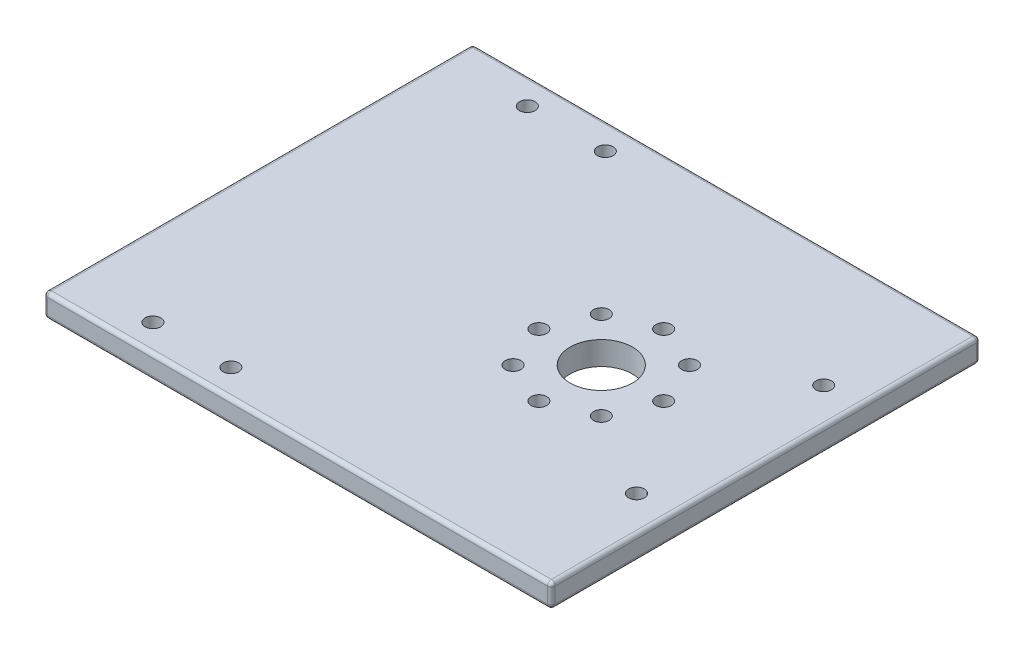
ISO-10303-21;
HEADER;
FILE_DESCRIPTION(('STEP AP214'),'2;1');
FILE_NAME('part.step','',(''),(''),'','','');
FILE_SCHEMA(('AUTOMOTIVE_DESIGN { 1 0 10303 214 1 1 1 1 }'));
ENDSEC;
DATA;
#1=APPLICATION_CONTEXT('core data for automotive mechanical design processes');
#2=APPLICATION_PROTOCOL_DEFINITION('international standard','automotive_design',2000,#1);
#3=PRODUCT_CONTEXT('',#1,'mechanical');
#4=PRODUCT('Part','Part','',(#3));
#5=PRODUCT_RELATED_PRODUCT_CATEGORY('part','',(#4));
#6=PRODUCT_DEFINITION_FORMATION('','',#4);
#7=PRODUCT_DEFINITION_CONTEXT('part definition',#1,'design');
#8=PRODUCT_DEFINITION('design','',#6,#7);
#9=PRODUCT_DEFINITION_SHAPE('','',#8);
#10=(LENGTH_UNIT() NAMED_UNIT(*) SI_UNIT(.MILLI.,.METRE.));
#11=(NAMED_UNIT(*) PLANE_ANGLE_UNIT() SI_UNIT($,.RADIAN.));
#12=(NAMED_UNIT(*) SI_UNIT($,.STERADIAN.) SOLID_ANGLE_UNIT());
#13=UNCERTAINTY_MEASURE_WITH_UNIT(LENGTH_MEASURE(1.E-05),#10,'distance_accuracy_value','');
#14=(GEOMETRIC_REPRESENTATION_CONTEXT(3) GLOBAL_UNCERTAINTY_ASSIGNED_CONTEXT((#13)) GLOBAL_UNIT_ASSIGNED_CONTEXT((#10,
#11,#12)) REPRESENTATION_CONTEXT('',''));
#15=CARTESIAN_POINT('',(0.,0.,0.));
#16=DIRECTION('',(0.,0.,1.));
#17=DIRECTION('',(1.,0.,0.));
#18=AXIS2_PLACEMENT_3D('',#15,#16,#17);
#19=CARTESIAN_POINT('',(0.,551.352995908306,0.));
#20=DIRECTION('',(0.,1.,0.));
#21=DIRECTION('',(0.,0.,1.));
#22=AXIS2_PLACEMENT_3D('',#19,#20,#21);
#23=PLANE('',#22);
#24=CARTESIAN_POINT('',(-33.4856774546059,551.352995908306,-24.));
#25=DIRECTION('',(0.,1.,0.));
#26=DIRECTION('',(0.,0.,1.));
#27=AXIS2_PLACEMENT_3D('',#24,#25,#26);
#28=CIRCLE('',#27,0.999999999999998);
#29=CARTESIAN_POINT('',(-33.4856774546059,551.352995908306,-23.));
#30=VERTEX_POINT('',#29);
#31=EDGE_CURVE('E840',#30,#30,#28,.T.);
#32=ORIENTED_EDGE('',*,*,#31,.F.);
#33=EDGE_LOOP('',(#32));
#34=FACE_BOUND('',#33,.T.);
#35=CARTESIAN_POINT('',(-23.4856774546059,551.352995908306,-24.));
#36=DIRECTION('',(0.,1.,0.));
#37=DIRECTION('',(0.,0.,1.));
#38=AXIS2_PLACEMENT_3D('',#35,#36,#37);
#39=CIRCLE('',#38,1.);
#40=CARTESIAN_POINT('',(-23.4856774546059,551.352995908306,-23.));
#41=VERTEX_POINT('',#40);
#42=EDGE_CURVE('E846',#41,#41,#39,.T.);
#43=ORIENTED_EDGE('',*,*,#42,.F.);
#44=EDGE_LOOP('',(#43));
#45=FACE_BOUND('',#44,.T.);
#46=CARTESIAN_POINT('',(16.5143225453941,551.352995908306,-12.));
#47=DIRECTION('',(0.,1.,0.));
#48=DIRECTION('',(0.,0.,1.));
#49=AXIS2_PLACEMENT_3D('',#46,#47,#48);
#50=CIRCLE('',#49,1.);
#51=CARTESIAN_POINT('',(16.5143225453941,551.352995908306,-11.));
#52=VERTEX_POINT('',#51);
#53=EDGE_CURVE('E852',#52,#52,#50,.T.);
#54=ORIENTED_EDGE('',*,*,#53,.F.);
#55=EDGE_LOOP('',(#54));
#56=FACE_BOUND('',#55,.T.);
#57=CARTESIAN_POINT('',(16.5143225453941,551.352995908306,12.));
#58=DIRECTION('',(0.,1.,0.));
#59=DIRECTION('',(0.,0.,1.));
#60=AXIS2_PLACEMENT_3D('',#57,#58,#59);
#61=CIRCLE('',#60,1.);
#62=CARTESIAN_POINT('',(16.5143225453941,551.352995908306,13.));
#63=VERTEX_POINT('',#62);
#64=EDGE_CURVE('E858',#63,#63,#61,.T.);
#65=ORIENTED_EDGE('',*,*,#64,.F.);
#66=EDGE_LOOP('',(#65));
#67=FACE_BOUND('',#66,.T.);
#68=CARTESIAN_POINT('',(-23.4856774546059,551.352995908306,24.));
#69=DIRECTION('',(0.,1.,0.));
#70=DIRECTION('',(0.,0.,1.));
#71=AXIS2_PLACEMENT_3D('',#68,#69,#70);
#72=CIRCLE('',#71,0.999999999999998);
#73=CARTESIAN_POINT('',(-23.4856774546059,551.352995908306,25.));
#74=VERTEX_POINT('',#73);
#75=EDGE_CURVE('E834',#74,#74,#72,.T.);
#76=ORIENTED_EDGE('',*,*,#75,.F.);
#77=EDGE_LOOP('',(#76));
#78=FACE_BOUND('',#77,.T.);
#79=CARTESIAN_POINT('',(-33.4856774546059,551.352995908306,24.));
#80=DIRECTION('',(0.,1.,0.));
#81=DIRECTION('',(0.,0.,1.));
#82=AXIS2_PLACEMENT_3D('',#79,#80,#81);
#83=CIRCLE('',#82,0.999999999999997);
#84=CARTESIAN_POINT('',(-33.4856774546059,551.352995908306,25.));
#85=VERTEX_POINT('',#84);
#86=EDGE_CURVE('E831',#85,#85,#83,.T.);
#87=ORIENTED_EDGE('',*,*,#86,.F.);
#88=EDGE_LOOP('',(#87));
#89=FACE_BOUND('',#88,.T.);
#90=DIRECTION('',(-1.,0.,0.));
#91=VECTOR('',#90,1.);
#92=CARTESIAN_POINT('',(-43.9856774546059,551.352995908306,-27.0000000000001));
#93=LINE('',#92,#91);
#94=CARTESIAN_POINT('',(20.5941683509698,551.352995908306,-27.0000000000001));
#95=VERTEX_POINT('',#94);
#96=CARTESIAN_POINT('',(-43.4856774546059,551.352995908306,-27.0000000000001));
#97=VERTEX_POINT('',#96);
#98=EDGE_CURVE('E160',#95,#97,#93,.T.);
#99=ORIENTED_EDGE('',*,*,#98,.T.);
#100=DIRECTION('',(0.,0.,1.));
#101=VECTOR('',#100,1.);
#102=CARTESIAN_POINT('',(-43.4856774546059,551.352995908306,27.4999999999999));
#103=LINE('',#102,#101);
#104=CARTESIAN_POINT('',(-43.4856774546059,551.352995908306,26.9999999999999));
#105=VERTEX_POINT('',#104);
#106=EDGE_CURVE('E131',#97,#105,#103,.T.);
#107=ORIENTED_EDGE('',*,*,#106,.T.);
#108=DIRECTION('',(1.,0.,0.));
#109=VECTOR('',#108,1.);
#110=CARTESIAN_POINT('',(21.0941683509698,551.352995908306,26.9999999999999));
#111=LINE('',#110,#109);
#112=CARTESIAN_POINT('',(20.5941683509698,551.352995908306,26.9999999999999));
#113=VERTEX_POINT('',#112);
#114=EDGE_CURVE('E149',#105,#113,#111,.T.);
#115=ORIENTED_EDGE('',*,*,#114,.T.);
#116=DIRECTION('',(0.,0.,-1.));
#117=VECTOR('',#116,1.);
#118=CARTESIAN_POINT('',(20.5941683509698,551.352995908306,-27.5000000000001));
#119=LINE('',#118,#117);
#120=EDGE_CURVE('E155',#113,#95,#119,.T.);
#121=ORIENTED_EDGE('',*,*,#120,.T.);
#122=EDGE_LOOP('',(#99,#107,#115,#121));
#123=FACE_BOUND('',#122,.T.);
#124=CARTESIAN_POINT('',(0.,551.352995908306,-7.99999999999991));
#125=DIRECTION('',(0.,1.,0.));
#126=DIRECTION('',(0.,0.,1.));
#127=AXIS2_PLACEMENT_3D('',#124,#125,#126);
#128=CIRCLE('',#127,0.999999999999999);
#129=CARTESIAN_POINT('',(0.,551.352995908306,-6.99999999999991));
#130=VERTEX_POINT('',#129);
#131=EDGE_CURVE('E824',#130,#130,#128,.T.);
#132=ORIENTED_EDGE('',*,*,#131,.F.);
#133=EDGE_LOOP('',(#132));
#134=FACE_BOUND('',#133,.T.);
#135=CARTESIAN_POINT('',(5.656854249492,551.352995908306,-5.656854249492));
#136=DIRECTION('',(0.,1.,0.));
#137=DIRECTION('',(0.,0.,1.));
#138=AXIS2_PLACEMENT_3D('',#135,#136,#137);
#139=CIRCLE('',#138,0.999999999999976);
#140=CARTESIAN_POINT('',(5.656854249492,551.352995908306,-4.65685424949202));
#141=VERTEX_POINT('',#140);
#142=EDGE_CURVE('E821',#141,#141,#139,.T.);
#143=ORIENTED_EDGE('',*,*,#142,.F.);
#144=EDGE_LOOP('',(#143));
#145=FACE_BOUND('',#144,.T.);
#146=CARTESIAN_POINT('',(8.,551.352995908306,0.));
#147=DIRECTION('',(0.,1.,0.));
#148=DIRECTION('',(0.,0.,1.));
#149=AXIS2_PLACEMENT_3D('',#146,#147,#148);
#150=CIRCLE('',#149,1.);
#151=CARTESIAN_POINT('',(8.,551.352995908306,1.00000000000009));
#152=VERTEX_POINT('',#151);
#153=EDGE_CURVE('E815',#152,#152,#150,.T.);
#154=ORIENTED_EDGE('',*,*,#153,.F.);
#155=EDGE_LOOP('',(#154));
#156=FACE_BOUND('',#155,.T.);
#157=CARTESIAN_POINT('',(5.656854249492,551.352995908306,5.656854249492));
#158=DIRECTION('',(0.,1.,0.));
#159=DIRECTION('',(0.,0.,1.));
#160=AXIS2_PLACEMENT_3D('',#157,#158,#159);
#161=CIRCLE('',#160,0.999999999999976);
#162=CARTESIAN_POINT('',(5.656854249492,551.352995908306,6.65685424949198));
#163=VERTEX_POINT('',#162);
#164=EDGE_CURVE('E809',#163,#163,#161,.T.);
#165=ORIENTED_EDGE('',*,*,#164,.F.);
#166=EDGE_LOOP('',(#165));
#167=FACE_BOUND('',#166,.T.);
#168=CARTESIAN_POINT('',(0.,551.352995908306,8.00000000000009));
#169=DIRECTION('',(0.,1.,0.));
#170=DIRECTION('',(0.,0.,1.));
#171=AXIS2_PLACEMENT_3D('',#168,#169,#170);
#172=CIRCLE('',#171,1.);
#173=CARTESIAN_POINT('',(0.,551.352995908306,9.00000000000009));
#174=VERTEX_POINT('',#173);
#175=EDGE_CURVE('E803',#174,#174,#172,.T.);
#176=ORIENTED_EDGE('',*,*,#175,.F.);
#177=EDGE_LOOP('',(#176));
#178=FACE_BOUND('',#177,.T.);
#179=CARTESIAN_POINT('',(-5.656854249492,551.352995908306,5.656854249492));
#180=DIRECTION('',(0.,1.,0.));
#181=DIRECTION('',(0.,0.,1.));
#182=AXIS2_PLACEMENT_3D('',#179,#180,#181);
#183=CIRCLE('',#182,0.999999999999975);
#184=CARTESIAN_POINT('',(-5.656854249492,551.352995908306,6.65685424949198));
#185=VERTEX_POINT('',#184);
#186=EDGE_CURVE('E797',#185,#185,#183,.T.);
#187=ORIENTED_EDGE('',*,*,#186,.F.);
#188=EDGE_LOOP('',(#187));
#189=FACE_BOUND('',#188,.T.);
#190=CARTESIAN_POINT('',(-8.,551.352995908306,0.));
#191=DIRECTION('',(0.,1.,0.));
#192=DIRECTION('',(0.,0.,1.));
#193=AXIS2_PLACEMENT_3D('',#190,#191,#192);
#194=CIRCLE('',#193,1.);
#195=CARTESIAN_POINT('',(-8.,551.352995908306,1.00000000000009));
#196=VERTEX_POINT('',#195);
#197=EDGE_CURVE('E273',#196,#196,#194,.T.);
#198=ORIENTED_EDGE('',*,*,#197,.F.);
#199=EDGE_LOOP('',(#198));
#200=FACE_BOUND('',#199,.T.);
#201=CARTESIAN_POINT('',(-5.656854249492,551.352995908306,-5.656854249492));
#202=DIRECTION('',(0.,1.,0.));
#203=DIRECTION('',(0.,0.,1.));
#204=AXIS2_PLACEMENT_3D('',#201,#202,#203);
#205=CIRCLE('',#204,0.999999999999975);
#206=CARTESIAN_POINT('',(-5.656854249492,551.352995908306,-4.65685424949202));
#207=VERTEX_POINT('',#206);
#208=EDGE_CURVE('E265',#207,#207,#205,.T.);
#209=ORIENTED_EDGE('',*,*,#208,.F.);
#210=EDGE_LOOP('',(#209));
#211=FACE_BOUND('',#210,.T.);
#212=CARTESIAN_POINT('',(0.,551.352995908306,0.));
#213=DIRECTION('',(0.,1.,0.));
#214=DIRECTION('',(0.,0.,1.));
#215=AXIS2_PLACEMENT_3D('',#212,#213,#214);
#216=CIRCLE('',#215,3.99999999999991);
#217=CARTESIAN_POINT('',(0.,551.352995908306,3.99999999999982));
#218=VERTEX_POINT('',#217);
#219=EDGE_CURVE('E156',#218,#218,#216,.T.);
#220=ORIENTED_EDGE('',*,*,#219,.F.);
#221=EDGE_LOOP('',(#220));
#222=FACE_BOUND('',#221,.T.);
#223=ADVANCED_FACE('F37',(#34,#45,#56,#67,#78,#89,#123,#134,#145,#156,#167,#178,#189,#200,#211,
#222),#23,.T.);
#224=CARTESIAN_POINT('',(0.,548.352995908306,0.));
#225=DIRECTION('',(0.,1.,0.));
#226=DIRECTION('',(0.,0.,1.));
#227=AXIS2_PLACEMENT_3D('',#224,#225,#226);
#228=PLANE('',#227);
#229=CARTESIAN_POINT('',(-33.4856774546059,548.352995908306,-24.));
#230=DIRECTION('',(0.,1.,0.));
#231=DIRECTION('',(0.,0.,1.));
#232=AXIS2_PLACEMENT_3D('',#229,#230,#231);
#233=CIRCLE('',#232,0.999999999999998);
#234=CARTESIAN_POINT('',(-33.4856774546059,548.352995908306,-23.));
#235=VERTEX_POINT('',#234);
#236=EDGE_CURVE('E837',#235,#235,#233,.T.);
#237=ORIENTED_EDGE('',*,*,#236,.T.);
#238=EDGE_LOOP('',(#237));
#239=FACE_BOUND('',#238,.T.);
#240=CARTESIAN_POINT('',(-23.4856774546059,548.352995908306,-24.));
#241=DIRECTION('',(0.,1.,0.));
#242=DIRECTION('',(0.,0.,1.));
#243=AXIS2_PLACEMENT_3D('',#240,#241,#242);
#244=CIRCLE('',#243,1.);
#245=CARTESIAN_POINT('',(-23.4856774546059,548.352995908306,-23.));
#246=VERTEX_POINT('',#245);
#247=EDGE_CURVE('E843',#246,#246,#244,.T.);
#248=ORIENTED_EDGE('',*,*,#247,.T.);
#249=EDGE_LOOP('',(#248));
#250=FACE_BOUND('',#249,.T.);
#251=CARTESIAN_POINT('',(16.5143225453941,548.352995908306,-12.));
#252=DIRECTION('',(0.,1.,0.));
#253=DIRECTION('',(0.,0.,1.));
#254=AXIS2_PLACEMENT_3D('',#251,#252,#253);
#255=CIRCLE('',#254,1.);
#256=CARTESIAN_POINT('',(16.5143225453941,548.352995908306,-11.));
#257=VERTEX_POINT('',#256);
#258=EDGE_CURVE('E849',#257,#257,#255,.T.);
#259=ORIENTED_EDGE('',*,*,#258,.T.);
#260=EDGE_LOOP('',(#259));
#261=FACE_BOUND('',#260,.T.);
#262=CARTESIAN_POINT('',(16.5143225453941,548.352995908306,12.));
#263=DIRECTION('',(0.,1.,0.));
#264=DIRECTION('',(0.,0.,1.));
#265=AXIS2_PLACEMENT_3D('',#262,#263,#264);
#266=CIRCLE('',#265,1.);
#267=CARTESIAN_POINT('',(16.5143225453941,548.352995908306,13.));
#268=VERTEX_POINT('',#267);
#269=EDGE_CURVE('E855',#268,#268,#266,.T.);
#270=ORIENTED_EDGE('',*,*,#269,.T.);
#271=EDGE_LOOP('',(#270));
#272=FACE_BOUND('',#271,.T.);
#273=CARTESIAN_POINT('',(-23.4856774546059,548.352995908306,24.));
#274=DIRECTION('',(0.,1.,0.));
#275=DIRECTION('',(0.,0.,1.));
#276=AXIS2_PLACEMENT_3D('',#273,#274,#275);
#277=CIRCLE('',#276,0.999999999999998);
#278=CARTESIAN_POINT('',(-23.4856774546059,548.352995908306,25.));
#279=VERTEX_POINT('',#278);
#280=EDGE_CURVE('E861',#279,#279,#277,.T.);
#281=ORIENTED_EDGE('',*,*,#280,.T.);
#282=EDGE_LOOP('',(#281));
#283=FACE_BOUND('',#282,.T.);
#284=CARTESIAN_POINT('',(-33.4856774546059,548.352995908306,24.));
#285=DIRECTION('',(0.,1.,0.));
#286=DIRECTION('',(0.,0.,1.));
#287=AXIS2_PLACEMENT_3D('',#284,#285,#286);
#288=CIRCLE('',#287,0.999999999999997);
#289=CARTESIAN_POINT('',(-33.4856774546059,548.352995908306,25.));
#290=VERTEX_POINT('',#289);
#291=EDGE_CURVE('E137',#290,#290,#288,.T.);
#292=ORIENTED_EDGE('',*,*,#291,.T.);
#293=EDGE_LOOP('',(#292));
#294=FACE_BOUND('',#293,.T.);
#295=DIRECTION('',(1.,0.,0.));
#296=VECTOR('',#295,1.);
#297=CARTESIAN_POINT('',(0.,548.352995908306,26.9999999999999));
#298=LINE('',#297,#296);
#299=CARTESIAN_POINT('',(20.5941683509698,548.352995908306,26.9999999999999));
#300=VERTEX_POINT('',#299);
#301=CARTESIAN_POINT('',(-43.4856774546059,548.352995908306,26.9999999999999));
#302=VERTEX_POINT('',#301);
#303=EDGE_CURVE('E173',#300,#302,#298,.F.);
#304=ORIENTED_EDGE('',*,*,#303,.T.);
#305=DIRECTION('',(0.,0.,1.));
#306=VECTOR('',#305,1.);
#307=CARTESIAN_POINT('',(-43.4856774546059,548.352995908306,0.));
#308=LINE('',#307,#306);
#309=CARTESIAN_POINT('',(-43.4856774546059,548.352995908306,-27.0000000000001));
#310=VERTEX_POINT('',#309);
#311=EDGE_CURVE('E179',#302,#310,#308,.F.);
#312=ORIENTED_EDGE('',*,*,#311,.T.);
#313=DIRECTION('',(-1.,0.,0.));
#314=VECTOR('',#313,1.);
#315=CARTESIAN_POINT('',(0.,548.352995908306,-27.0000000000001));
#316=LINE('',#315,#314);
#317=CARTESIAN_POINT('',(20.5941683509698,548.352995908306,-27.0000000000001));
#318=VERTEX_POINT('',#317);
#319=EDGE_CURVE('E177',#310,#318,#316,.F.);
#320=ORIENTED_EDGE('',*,*,#319,.T.);
#321=DIRECTION('',(0.,0.,-1.));
#322=VECTOR('',#321,1.);
#323=CARTESIAN_POINT('',(20.5941683509698,548.352995908306,0.));
#324=LINE('',#323,#322);
#325=EDGE_CURVE('E175',#318,#300,#324,.F.);
#326=ORIENTED_EDGE('',*,*,#325,.T.);
#327=EDGE_LOOP('',(#304,#312,#320,#326));
#328=FACE_BOUND('',#327,.T.);
#329=CARTESIAN_POINT('',(0.,548.352995908306,-7.99999999999991));
#330=DIRECTION('',(0.,1.,0.));
#331=DIRECTION('',(0.,0.,1.));
#332=AXIS2_PLACEMENT_3D('',#329,#330,#331);
#333=CIRCLE('',#332,0.999999999999999);
#334=CARTESIAN_POINT('',(0.,548.352995908306,-6.99999999999991));
#335=VERTEX_POINT('',#334);
#336=EDGE_CURVE('E280',#335,#335,#333,.F.);
#337=ORIENTED_EDGE('',*,*,#336,.F.);
#338=EDGE_LOOP('',(#337));
#339=FACE_BOUND('',#338,.T.);
#340=CARTESIAN_POINT('',(5.656854249492,548.352995908306,-5.656854249492));
#341=DIRECTION('',(0.,1.,0.));
#342=DIRECTION('',(0.,0.,1.));
#343=AXIS2_PLACEMENT_3D('',#340,#341,#342);
#344=CIRCLE('',#343,0.999999999999976);
#345=CARTESIAN_POINT('',(5.656854249492,548.352995908306,-4.65685424949202));
#346=VERTEX_POINT('',#345);
#347=EDGE_CURVE('E818',#346,#346,#344,.F.);
#348=ORIENTED_EDGE('',*,*,#347,.F.);
#349=EDGE_LOOP('',(#348));
#350=FACE_BOUND('',#349,.T.);
#351=CARTESIAN_POINT('',(8.,548.352995908306,0.));
#352=DIRECTION('',(0.,1.,0.));
#353=DIRECTION('',(0.,0.,1.));
#354=AXIS2_PLACEMENT_3D('',#351,#352,#353);
#355=CIRCLE('',#354,1.);
#356=CARTESIAN_POINT('',(8.,548.352995908306,1.00000000000009));
#357=VERTEX_POINT('',#356);
#358=EDGE_CURVE('E812',#357,#357,#355,.F.);
#359=ORIENTED_EDGE('',*,*,#358,.F.);
#360=EDGE_LOOP('',(#359));
#361=FACE_BOUND('',#360,.T.);
#362=CARTESIAN_POINT('',(5.656854249492,548.352995908306,5.656854249492));
#363=DIRECTION('',(0.,1.,0.));
#364=DIRECTION('',(0.,0.,1.));
#365=AXIS2_PLACEMENT_3D('',#362,#363,#364);
#366=CIRCLE('',#365,0.999999999999976);
#367=CARTESIAN_POINT('',(5.656854249492,548.352995908306,6.65685424949198));
#368=VERTEX_POINT('',#367);
#369=EDGE_CURVE('E806',#368,#368,#366,.F.);
#370=ORIENTED_EDGE('',*,*,#369,.F.);
#371=EDGE_LOOP('',(#370));
#372=FACE_BOUND('',#371,.T.);
#373=CARTESIAN_POINT('',(0.,548.352995908306,8.00000000000009));
#374=DIRECTION('',(0.,1.,0.));
#375=DIRECTION('',(0.,0.,1.));
#376=AXIS2_PLACEMENT_3D('',#373,#374,#375);
#377=CIRCLE('',#376,1.);
#378=CARTESIAN_POINT('',(0.,548.352995908306,9.00000000000009));
#379=VERTEX_POINT('',#378);
#380=EDGE_CURVE('E801',#379,#379,#377,.F.);
#381=ORIENTED_EDGE('',*,*,#380,.F.);
#382=EDGE_LOOP('',(#381));
#383=FACE_BOUND('',#382,.T.);
#384=CARTESIAN_POINT('',(-5.656854249492,548.352995908306,5.656854249492));
#385=DIRECTION('',(0.,1.,0.));
#386=DIRECTION('',(0.,0.,1.));
#387=AXIS2_PLACEMENT_3D('',#384,#385,#386);
#388=CIRCLE('',#387,0.999999999999975);
#389=CARTESIAN_POINT('',(-5.656854249492,548.352995908306,6.65685424949198));
#390=VERTEX_POINT('',#389);
#391=EDGE_CURVE('E795',#390,#390,#388,.F.);
#392=ORIENTED_EDGE('',*,*,#391,.F.);
#393=EDGE_LOOP('',(#392));
#394=FACE_BOUND('',#393,.T.);
#395=CARTESIAN_POINT('',(-8.,548.352995908306,0.));
#396=DIRECTION('',(0.,1.,0.));
#397=DIRECTION('',(0.,0.,1.));
#398=AXIS2_PLACEMENT_3D('',#395,#396,#397);
#399=CIRCLE('',#398,1.);
#400=CARTESIAN_POINT('',(-8.,548.352995908306,1.00000000000009));
#401=VERTEX_POINT('',#400);
#402=EDGE_CURVE('E270',#401,#401,#399,.F.);
#403=ORIENTED_EDGE('',*,*,#402,.F.);
#404=EDGE_LOOP('',(#403));
#405=FACE_BOUND('',#404,.T.);
#406=CARTESIAN_POINT('',(-5.656854249492,548.352995908306,-5.656854249492));
#407=DIRECTION('',(0.,1.,0.));
#408=DIRECTION('',(0.,0.,1.));
#409=AXIS2_PLACEMENT_3D('',#406,#407,#408);
#410=CIRCLE('',#409,0.999999999999975);
#411=CARTESIAN_POINT('',(-5.656854249492,548.352995908306,-4.65685424949202));
#412=VERTEX_POINT('',#411);
#413=EDGE_CURVE('E259',#412,#412,#410,.F.);
#414=ORIENTED_EDGE('',*,*,#413,.F.);
#415=EDGE_LOOP('',(#414));
#416=FACE_BOUND('',#415,.T.);
#417=CARTESIAN_POINT('',(0.,548.352995908306,0.));
#418=DIRECTION('',(0.,1.,0.));
#419=DIRECTION('',(0.,0.,1.));
#420=AXIS2_PLACEMENT_3D('',#417,#418,#419);
#421=CIRCLE('',#420,3.99999999999991);
#422=CARTESIAN_POINT('',(0.,548.352995908306,3.99999999999982));
#423=VERTEX_POINT('',#422);
#424=EDGE_CURVE('E278',#423,#423,#421,.T.);
#425=ORIENTED_EDGE('',*,*,#424,.T.);
#426=EDGE_LOOP('',(#425));
#427=FACE_BOUND('',#426,.T.);
#428=ADVANCED_FACE('F335',(#239,#250,#261,#272,#283,#294,#328,#339,#350,#361,#372,#383,#394,
#405,#416,#427),#228,.F.);
#429=CARTESIAN_POINT('',(-43.9856774546059,551.352995908306,-27.5000000000001));
#430=DIRECTION('',(1.,0.,0.));
#431=DIRECTION('',(0.,0.,-1.));
#432=AXIS2_PLACEMENT_3D('',#429,#430,#431);
#433=PLANE('',#432);
#434=DIRECTION('',(0.,0.,1.));
#435=VECTOR('',#434,1.);
#436=CARTESIAN_POINT('',(-43.9856774546059,550.852995908306,-27.5000000000001));
#437=LINE('',#436,#435);
#438=CARTESIAN_POINT('',(-43.9856774546059,550.852995908306,26.9999999999999));
#439=VERTEX_POINT('',#438);
#440=CARTESIAN_POINT('',(-43.9856774546059,550.852995908306,-27.0000000000001));
#441=VERTEX_POINT('',#440);
#442=EDGE_CURVE('E133',#439,#441,#437,.F.);
#443=ORIENTED_EDGE('',*,*,#442,.T.);
#444=DIRECTION('',(0.,-1.,0.));
#445=VECTOR('',#444,1.);
#446=CARTESIAN_POINT('',(-43.9856774546059,551.352995908306,-27.0000000000001));
#447=LINE('',#446,#445);
#448=CARTESIAN_POINT('',(-43.9856774546059,548.852995908306,-27.0000000000001));
#449=VERTEX_POINT('',#448);
#450=EDGE_CURVE('E171',#441,#449,#447,.T.);
#451=ORIENTED_EDGE('',*,*,#450,.T.);
#452=DIRECTION('',(0.,0.,1.));
#453=VECTOR('',#452,1.);
#454=CARTESIAN_POINT('',(-43.9856774546059,548.852995908306,-27.5000000000001));
#455=LINE('',#454,#453);
#456=CARTESIAN_POINT('',(-43.9856774546059,548.852995908306,26.9999999999999));
#457=VERTEX_POINT('',#456);
#458=EDGE_CURVE('E164',#449,#457,#455,.T.);
#459=ORIENTED_EDGE('',*,*,#458,.T.);
#460=DIRECTION('',(0.,-1.,0.));
#461=VECTOR('',#460,1.);
#462=CARTESIAN_POINT('',(-43.9856774546059,551.352995908306,26.9999999999999));
#463=LINE('',#462,#461);
#464=EDGE_CURVE('E162',#457,#439,#463,.F.);
#465=ORIENTED_EDGE('',*,*,#464,.T.);
#466=EDGE_LOOP('',(#443,#451,#459,#465));
#467=FACE_BOUND('',#466,.T.);
#468=ADVANCED_FACE('F305',(#467),#433,.F.);
#469=CARTESIAN_POINT('',(-43.9856774546059,551.352995908306,27.4999999999999));
#470=DIRECTION('',(0.,0.,-1.));
#471=DIRECTION('',(0.,1.,0.));
#472=AXIS2_PLACEMENT_3D('',#469,#470,#471);
#473=PLANE('',#472);
#474=DIRECTION('',(1.,0.,0.));
#475=VECTOR('',#474,1.);
#476=CARTESIAN_POINT('',(-43.9856774546059,550.852995908306,27.4999999999999));
#477=LINE('',#476,#475);
#478=CARTESIAN_POINT('',(20.5941683509698,550.852995908306,27.4999999999999));
#479=VERTEX_POINT('',#478);
#480=CARTESIAN_POINT('',(-43.4856774546059,550.852995908306,27.4999999999999));
#481=VERTEX_POINT('',#480);
#482=EDGE_CURVE('E46',#479,#481,#477,.F.);
#483=ORIENTED_EDGE('',*,*,#482,.T.);
#484=DIRECTION('',(0.,-1.,0.));
#485=VECTOR('',#484,1.);
#486=CARTESIAN_POINT('',(-43.4856774546059,551.352995908306,27.4999999999999));
#487=LINE('',#486,#485);
#488=CARTESIAN_POINT('',(-43.4856774546059,548.852995908306,27.4999999999999));
#489=VERTEX_POINT('',#488);
#490=EDGE_CURVE('E11',#481,#489,#487,.T.);
#491=ORIENTED_EDGE('',*,*,#490,.T.);
#492=DIRECTION('',(1.,0.,0.));
#493=VECTOR('',#492,1.);
#494=CARTESIAN_POINT('',(-43.9856774546059,548.852995908306,27.4999999999999));
#495=LINE('',#494,#493);
#496=CARTESIAN_POINT('',(20.5941683509698,548.852995908306,27.4999999999999));
#497=VERTEX_POINT('',#496);
#498=EDGE_CURVE('E200',#489,#497,#495,.T.);
#499=ORIENTED_EDGE('',*,*,#498,.T.);
#500=DIRECTION('',(0.,-1.,0.));
#501=VECTOR('',#500,1.);
#502=CARTESIAN_POINT('',(20.5941683509698,551.352995908306,27.4999999999999));
#503=LINE('',#502,#501);
#504=EDGE_CURVE('E57',#497,#479,#503,.F.);
#505=ORIENTED_EDGE('',*,*,#504,.T.);
#506=EDGE_LOOP('',(#483,#491,#499,#505));
#507=FACE_BOUND('',#506,.T.);
#508=ADVANCED_FACE('F311',(#507),#473,.F.);
#509=CARTESIAN_POINT('',(21.0941683509698,551.352995908306,-27.5000000000001));
#510=DIRECTION('',(-1.,0.,0.));
#511=DIRECTION('',(0.,0.,1.));
#512=AXIS2_PLACEMENT_3D('',#509,#510,#511);
#513=PLANE('',#512);
#514=DIRECTION('',(0.,-1.,0.));
#515=VECTOR('',#514,1.);
#516=CARTESIAN_POINT('',(21.0941683509698,551.352995908306,-27.0000000000001));
#517=LINE('',#516,#515);
#518=CARTESIAN_POINT('',(21.0941683509698,548.852995908306,-27.0000000000001));
#519=VERTEX_POINT('',#518);
#520=CARTESIAN_POINT('',(21.0941683509698,550.852995908306,-27.0000000000001));
#521=VERTEX_POINT('',#520);
#522=EDGE_CURVE('E195',#519,#521,#517,.F.);
#523=ORIENTED_EDGE('',*,*,#522,.T.);
#524=DIRECTION('',(0.,0.,-1.));
#525=VECTOR('',#524,1.);
#526=CARTESIAN_POINT('',(21.0941683509698,550.852995908306,27.4999999999999));
#527=LINE('',#526,#525);
#528=CARTESIAN_POINT('',(21.0941683509698,550.852995908306,26.9999999999999));
#529=VERTEX_POINT('',#528);
#530=EDGE_CURVE('E197',#521,#529,#527,.F.);
#531=ORIENTED_EDGE('',*,*,#530,.T.);
#532=DIRECTION('',(0.,-1.,0.));
#533=VECTOR('',#532,1.);
#534=CARTESIAN_POINT('',(21.0941683509698,551.352995908306,26.9999999999999));
#535=LINE('',#534,#533);
#536=CARTESIAN_POINT('',(21.0941683509698,548.852995908306,26.9999999999999));
#537=VERTEX_POINT('',#536);
#538=EDGE_CURVE('E191',#529,#537,#535,.T.);
#539=ORIENTED_EDGE('',*,*,#538,.T.);
#540=DIRECTION('',(0.,0.,-1.));
#541=VECTOR('',#540,1.);
#542=CARTESIAN_POINT('',(21.0941683509698,548.852995908306,-27.5000000000001));
#543=LINE('',#542,#541);
#544=EDGE_CURVE('E193',#537,#519,#543,.T.);
#545=ORIENTED_EDGE('',*,*,#544,.T.);
#546=EDGE_LOOP('',(#523,#531,#539,#545));
#547=FACE_BOUND('',#546,.T.);
#548=ADVANCED_FACE('F352',(#547),#513,.F.);
#549=CARTESIAN_POINT('',(-43.9856774546059,551.352995908306,-27.5000000000001));
#550=DIRECTION('',(0.,0.,1.));
#551=DIRECTION('',(1.,0.,0.));
#552=AXIS2_PLACEMENT_3D('',#549,#550,#551);
#553=PLANE('',#552);
#554=DIRECTION('',(0.,-1.,0.));
#555=VECTOR('',#554,1.);
#556=CARTESIAN_POINT('',(-43.4856774546059,551.352995908306,-27.5000000000001));
#557=LINE('',#556,#555);
#558=CARTESIAN_POINT('',(-43.4856774546059,548.852995908306,-27.5000000000001));
#559=VERTEX_POINT('',#558);
#560=CARTESIAN_POINT('',(-43.4856774546059,550.852995908306,-27.5000000000001));
#561=VERTEX_POINT('',#560);
#562=EDGE_CURVE('E186',#559,#561,#557,.F.);
#563=ORIENTED_EDGE('',*,*,#562,.T.);
#564=DIRECTION('',(-1.,0.,0.));
#565=VECTOR('',#564,1.);
#566=CARTESIAN_POINT('',(21.0941683509698,550.852995908306,-27.5000000000001));
#567=LINE('',#566,#565);
#568=CARTESIAN_POINT('',(20.5941683509698,550.852995908306,-27.5000000000001));
#569=VERTEX_POINT('',#568);
#570=EDGE_CURVE('E188',#561,#569,#567,.F.);
#571=ORIENTED_EDGE('',*,*,#570,.T.);
#572=DIRECTION('',(0.,-1.,0.));
#573=VECTOR('',#572,1.);
#574=CARTESIAN_POINT('',(20.5941683509698,551.352995908306,-27.5000000000001));
#575=LINE('',#574,#573);
#576=CARTESIAN_POINT('',(20.5941683509698,548.852995908306,-27.5000000000001));
#577=VERTEX_POINT('',#576);
#578=EDGE_CURVE('E182',#569,#577,#575,.T.);
#579=ORIENTED_EDGE('',*,*,#578,.T.);
#580=DIRECTION('',(-1.,0.,0.));
#581=VECTOR('',#580,1.);
#582=CARTESIAN_POINT('',(-43.9856774546059,548.852995908306,-27.5000000000001));
#583=LINE('',#582,#581);
#584=EDGE_CURVE('E184',#577,#559,#583,.T.);
#585=ORIENTED_EDGE('',*,*,#584,.T.);
#586=EDGE_LOOP('',(#563,#571,#579,#585));
#587=FACE_BOUND('',#586,.T.);
#588=ADVANCED_FACE('F349',(#587),#553,.F.);
#589=CARTESIAN_POINT('',(0.,551.352995908306,0.));
#590=DIRECTION('',(0.,-1.,0.));
#591=DIRECTION('',(0.,0.,-1.));
#592=AXIS2_PLACEMENT_3D('',#589,#590,#591);
#593=CYLINDRICAL_SURFACE('',#592,3.99999999999991);
#594=ORIENTED_EDGE('',*,*,#219,.T.);
#595=EDGE_LOOP('',(#594));
#596=FACE_BOUND('',#595,.T.);
#597=ORIENTED_EDGE('',*,*,#424,.F.);
#598=EDGE_LOOP('',(#597));
#599=FACE_BOUND('',#598,.T.);
#600=ADVANCED_FACE('F346',(#596,#599),#593,.F.);
#601=CARTESIAN_POINT('',(-5.656854249492,545.52456878356,-5.656854249492));
#602=DIRECTION('',(0.,1.,0.));
#603=DIRECTION('',(0.,0.,1.));
#604=AXIS2_PLACEMENT_3D('',#601,#602,#603);
#605=CYLINDRICAL_SURFACE('',#604,0.999999999999975);
#606=ORIENTED_EDGE('',*,*,#413,.T.);
#607=EDGE_LOOP('',(#606));
#608=FACE_BOUND('',#607,.T.);
#609=ORIENTED_EDGE('',*,*,#208,.T.);
#610=EDGE_LOOP('',(#609));
#611=FACE_BOUND('',#610,.T.);
#612=ADVANCED_FACE('F697',(#608,#611),#605,.F.);
#613=CARTESIAN_POINT('',(-8.,545.52456878356,0.));
#614=DIRECTION('',(0.,1.,0.));
#615=DIRECTION('',(0.,0.,1.));
#616=AXIS2_PLACEMENT_3D('',#613,#614,#615);
#617=CYLINDRICAL_SURFACE('',#616,1.);
#618=ORIENTED_EDGE('',*,*,#402,.T.);
#619=EDGE_LOOP('',(#618));
#620=FACE_BOUND('',#619,.T.);
#621=ORIENTED_EDGE('',*,*,#197,.T.);
#622=EDGE_LOOP('',(#621));
#623=FACE_BOUND('',#622,.T.);
#624=ADVANCED_FACE('F686',(#620,#623),#617,.F.);
#625=CARTESIAN_POINT('',(-5.656854249492,545.52456878356,5.656854249492));
#626=DIRECTION('',(0.,1.,0.));
#627=DIRECTION('',(0.,0.,1.));
#628=AXIS2_PLACEMENT_3D('',#625,#626,#627);
#629=CYLINDRICAL_SURFACE('',#628,0.999999999999975);
#630=ORIENTED_EDGE('',*,*,#391,.T.);
#631=EDGE_LOOP('',(#630));
#632=FACE_BOUND('',#631,.T.);
#633=ORIENTED_EDGE('',*,*,#186,.T.);
#634=EDGE_LOOP('',(#633));
#635=FACE_BOUND('',#634,.T.);
#636=ADVANCED_FACE('F675',(#632,#635),#629,.F.);
#637=CARTESIAN_POINT('',(0.,545.52456878356,8.00000000000009));
#638=DIRECTION('',(0.,1.,0.));
#639=DIRECTION('',(0.,0.,1.));
#640=AXIS2_PLACEMENT_3D('',#637,#638,#639);
#641=CYLINDRICAL_SURFACE('',#640,1.);
#642=ORIENTED_EDGE('',*,*,#380,.T.);
#643=EDGE_LOOP('',(#642));
#644=FACE_BOUND('',#643,.T.);
#645=ORIENTED_EDGE('',*,*,#175,.T.);
#646=EDGE_LOOP('',(#645));
#647=FACE_BOUND('',#646,.T.);
#648=ADVANCED_FACE('F664',(#644,#647),#641,.F.);
#649=CARTESIAN_POINT('',(5.656854249492,545.52456878356,5.656854249492));
#650=DIRECTION('',(0.,1.,0.));
#651=DIRECTION('',(0.,0.,1.));
#652=AXIS2_PLACEMENT_3D('',#649,#650,#651);
#653=CYLINDRICAL_SURFACE('',#652,0.999999999999976);
#654=ORIENTED_EDGE('',*,*,#369,.T.);
#655=EDGE_LOOP('',(#654));
#656=FACE_BOUND('',#655,.T.);
#657=ORIENTED_EDGE('',*,*,#164,.T.);
#658=EDGE_LOOP('',(#657));
#659=FACE_BOUND('',#658,.T.);
#660=ADVANCED_FACE('F653',(#656,#659),#653,.F.);
#661=CARTESIAN_POINT('',(8.,545.52456878356,0.));
#662=DIRECTION('',(0.,1.,0.));
#663=DIRECTION('',(0.,0.,1.));
#664=AXIS2_PLACEMENT_3D('',#661,#662,#663);
#665=CYLINDRICAL_SURFACE('',#664,1.);
#666=ORIENTED_EDGE('',*,*,#358,.T.);
#667=EDGE_LOOP('',(#666));
#668=FACE_BOUND('',#667,.T.);
#669=ORIENTED_EDGE('',*,*,#153,.T.);
#670=EDGE_LOOP('',(#669));
#671=FACE_BOUND('',#670,.T.);
#672=ADVANCED_FACE('F642',(#668,#671),#665,.F.);
#673=CARTESIAN_POINT('',(5.656854249492,545.52456878356,-5.656854249492));
#674=DIRECTION('',(0.,1.,0.));
#675=DIRECTION('',(0.,0.,1.));
#676=AXIS2_PLACEMENT_3D('',#673,#674,#675);
#677=CYLINDRICAL_SURFACE('',#676,0.999999999999976);
#678=ORIENTED_EDGE('',*,*,#347,.T.);
#679=EDGE_LOOP('',(#678));
#680=FACE_BOUND('',#679,.T.);
#681=ORIENTED_EDGE('',*,*,#142,.T.);
#682=EDGE_LOOP('',(#681));
#683=FACE_BOUND('',#682,.T.);
#684=ADVANCED_FACE('F630',(#680,#683),#677,.F.);
#685=CARTESIAN_POINT('',(0.,545.52456878356,-7.99999999999991));
#686=DIRECTION('',(0.,1.,0.));
#687=DIRECTION('',(0.,0.,1.));
#688=AXIS2_PLACEMENT_3D('',#685,#686,#687);
#689=CYLINDRICAL_SURFACE('',#688,0.999999999999999);
#690=ORIENTED_EDGE('',*,*,#336,.T.);
#691=EDGE_LOOP('',(#690));
#692=FACE_BOUND('',#691,.T.);
#693=ORIENTED_EDGE('',*,*,#131,.T.);
#694=EDGE_LOOP('',(#693));
#695=FACE_BOUND('',#694,.T.);
#696=ADVANCED_FACE('F619',(#692,#695),#689,.F.);
#697=CARTESIAN_POINT('',(20.5941683509698,548.852995908306,-27.5000000000001));
#698=DIRECTION('',(0.,0.,-1.));
#699=DIRECTION('',(-1.,0.,0.));
#700=AXIS2_PLACEMENT_3D('',#697,#698,#699);
#701=CYLINDRICAL_SURFACE('',#700,0.5);
#702=CARTESIAN_POINT('',(20.5941683509698,548.852995908306,-27.0000000000001));
#703=DIRECTION('',(0.,0.,-1.));
#704=DIRECTION('',(-1.,0.,0.));
#705=AXIS2_PLACEMENT_3D('',#702,#703,#704);
#706=CIRCLE('',#705,0.5);
#707=EDGE_CURVE('E41',#519,#318,#706,.T.);
#708=ORIENTED_EDGE('',*,*,#707,.F.);
#709=ORIENTED_EDGE('',*,*,#544,.F.);
#710=CARTESIAN_POINT('',(20.5941683509698,548.852995908306,26.9999999999999));
#711=DIRECTION('',(0.,0.,1.));
#712=DIRECTION('',(1.,0.,0.));
#713=AXIS2_PLACEMENT_3D('',#710,#711,#712);
#714=CIRCLE('',#713,0.5);
#715=EDGE_CURVE('E252',#300,#537,#714,.T.);
#716=ORIENTED_EDGE('',*,*,#715,.F.);
#717=ORIENTED_EDGE('',*,*,#325,.F.);
#718=EDGE_LOOP('',(#708,#709,#716,#717));
#719=FACE_BOUND('',#718,.T.);
#720=ADVANCED_FACE('F39',(#719),#701,.T.);
#721=CARTESIAN_POINT('',(20.5941683509698,548.852995908306,-27.0000000000001));
#722=DIRECTION('',(0.,-1.,0.));
#723=DIRECTION('',(0.,0.,-1.));
#724=AXIS2_PLACEMENT_3D('',#721,#722,#723);
#725=SPHERICAL_SURFACE('',#724,0.5);
#726=CARTESIAN_POINT('',(20.5941683509698,548.852995908306,-27.0000000000001));
#727=DIRECTION('',(0.,-1.,0.));
#728=DIRECTION('',(0.,0.,-1.));
#729=AXIS2_PLACEMENT_3D('',#726,#727,#728);
#730=CIRCLE('',#729,0.5);
#731=EDGE_CURVE('E247',#519,#577,#730,.F.);
#732=ORIENTED_EDGE('',*,*,#731,.F.);
#733=ORIENTED_EDGE('',*,*,#707,.T.);
#734=CARTESIAN_POINT('',(20.5941683509698,548.852995908306,-27.0000000000001));
#735=DIRECTION('',(1.,0.,0.));
#736=DIRECTION('',(0.,0.,-1.));
#737=AXIS2_PLACEMENT_3D('',#734,#735,#736);
#738=CIRCLE('',#737,0.5);
#739=EDGE_CURVE('E250',#577,#318,#738,.F.);
#740=ORIENTED_EDGE('',*,*,#739,.F.);
#741=EDGE_LOOP('',(#732,#733,#740));
#742=FACE_BOUND('',#741,.T.);
#743=ADVANCED_FACE('F601',(#742),#725,.T.);
#744=CARTESIAN_POINT('',(20.5941683509698,548.852995908306,26.9999999999999));
#745=DIRECTION('',(1.,0.,0.));
#746=DIRECTION('',(0.,0.,-1.));
#747=AXIS2_PLACEMENT_3D('',#744,#745,#746);
#748=SPHERICAL_SURFACE('',#747,0.5);
#749=CARTESIAN_POINT('',(20.5941683509698,548.852995908306,26.9999999999999));
#750=DIRECTION('',(1.,0.,0.));
#751=DIRECTION('',(0.,0.,-1.));
#752=AXIS2_PLACEMENT_3D('',#749,#750,#751);
#753=CIRCLE('',#752,0.5);
#754=EDGE_CURVE('E241',#300,#497,#753,.F.);
#755=ORIENTED_EDGE('',*,*,#754,.F.);
#756=ORIENTED_EDGE('',*,*,#715,.T.);
#757=CARTESIAN_POINT('',(20.5941683509698,548.852995908306,26.9999999999999));
#758=DIRECTION('',(0.,-1.,0.));
#759=DIRECTION('',(0.,0.,-1.));
#760=AXIS2_PLACEMENT_3D('',#757,#758,#759);
#761=CIRCLE('',#760,0.5);
#762=EDGE_CURVE('E244',#497,#537,#761,.F.);
#763=ORIENTED_EDGE('',*,*,#762,.F.);
#764=EDGE_LOOP('',(#755,#756,#763));
#765=FACE_BOUND('',#764,.T.);
#766=ADVANCED_FACE('F317',(#765),#748,.T.);
#767=CARTESIAN_POINT('',(-43.9856774546059,548.852995908306,-27.0000000000001));
#768=DIRECTION('',(-1.,0.,0.));
#769=DIRECTION('',(0.,0.,1.));
#770=AXIS2_PLACEMENT_3D('',#767,#768,#769);
#771=CYLINDRICAL_SURFACE('',#770,0.5);
#772=ORIENTED_EDGE('',*,*,#739,.T.);
#773=ORIENTED_EDGE('',*,*,#319,.F.);
#774=CARTESIAN_POINT('',(-43.4856774546059,548.852995908306,-27.0000000000001));
#775=DIRECTION('',(-1.,0.,0.));
#776=DIRECTION('',(0.,0.,1.));
#777=AXIS2_PLACEMENT_3D('',#774,#775,#776);
#778=CIRCLE('',#777,0.5);
#779=EDGE_CURVE('E236',#559,#310,#778,.T.);
#780=ORIENTED_EDGE('',*,*,#779,.F.);
#781=ORIENTED_EDGE('',*,*,#584,.F.);
#782=EDGE_LOOP('',(#772,#773,#780,#781));
#783=FACE_BOUND('',#782,.T.);
#784=ADVANCED_FACE('F580',(#783),#771,.T.);
#785=CARTESIAN_POINT('',(20.5941683509698,551.352995908306,-27.0000000000001));
#786=DIRECTION('',(0.,-1.,0.));
#787=DIRECTION('',(0.,0.,-1.));
#788=AXIS2_PLACEMENT_3D('',#785,#786,#787);
#789=CYLINDRICAL_SURFACE('',#788,0.5);
#790=ORIENTED_EDGE('',*,*,#731,.T.);
#791=ORIENTED_EDGE('',*,*,#578,.F.);
#792=CARTESIAN_POINT('',(20.5941683509698,550.852995908306,-27.0000000000001));
#793=DIRECTION('',(0.,1.,0.));
#794=DIRECTION('',(0.,0.,1.));
#795=AXIS2_PLACEMENT_3D('',#792,#793,#794);
#796=CIRCLE('',#795,0.5);
#797=EDGE_CURVE('E233',#521,#569,#796,.T.);
#798=ORIENTED_EDGE('',*,*,#797,.F.);
#799=ORIENTED_EDGE('',*,*,#522,.F.);
#800=EDGE_LOOP('',(#790,#791,#798,#799));
#801=FACE_BOUND('',#800,.T.);
#802=ADVANCED_FACE('F570',(#801),#789,.T.);
#803=CARTESIAN_POINT('',(20.5941683509698,550.852995908306,0.));
#804=DIRECTION('',(0.,0.,1.));
#805=DIRECTION('',(1.,0.,0.));
#806=AXIS2_PLACEMENT_3D('',#803,#804,#805);
#807=CYLINDRICAL_SURFACE('',#806,0.5);
#808=CARTESIAN_POINT('',(20.5941683509698,550.852995908306,26.9999999999999));
#809=DIRECTION('',(0.,0.,1.));
#810=DIRECTION('',(1.,0.,0.));
#811=AXIS2_PLACEMENT_3D('',#808,#809,#810);
#812=CIRCLE('',#811,0.5);
#813=EDGE_CURVE('E227',#529,#113,#812,.T.);
#814=ORIENTED_EDGE('',*,*,#813,.F.);
#815=ORIENTED_EDGE('',*,*,#530,.F.);
#816=CARTESIAN_POINT('',(20.5941683509698,550.852995908306,-27.0000000000001));
#817=DIRECTION('',(0.,0.,-1.));
#818=DIRECTION('',(-1.,0.,0.));
#819=AXIS2_PLACEMENT_3D('',#816,#817,#818);
#820=CIRCLE('',#819,0.5);
#821=EDGE_CURVE('E230',#95,#521,#820,.T.);
#822=ORIENTED_EDGE('',*,*,#821,.F.);
#823=ORIENTED_EDGE('',*,*,#120,.F.);
#824=EDGE_LOOP('',(#814,#815,#822,#823));
#825=FACE_BOUND('',#824,.T.);
#826=ADVANCED_FACE('F286',(#825),#807,.T.);
#827=CARTESIAN_POINT('',(20.5941683509698,551.352995908306,26.9999999999999));
#828=DIRECTION('',(0.,-1.,0.));
#829=DIRECTION('',(0.,0.,-1.));
#830=AXIS2_PLACEMENT_3D('',#827,#828,#829);
#831=CYLINDRICAL_SURFACE('',#830,0.5);
#832=ORIENTED_EDGE('',*,*,#762,.T.);
#833=ORIENTED_EDGE('',*,*,#538,.F.);
#834=CARTESIAN_POINT('',(20.5941683509698,550.852995908306,26.9999999999999));
#835=DIRECTION('',(0.,1.,0.));
#836=DIRECTION('',(0.,0.,1.));
#837=AXIS2_PLACEMENT_3D('',#834,#835,#836);
#838=CIRCLE('',#837,0.5);
#839=EDGE_CURVE('E225',#479,#529,#838,.T.);
#840=ORIENTED_EDGE('',*,*,#839,.F.);
#841=ORIENTED_EDGE('',*,*,#504,.F.);
#842=EDGE_LOOP('',(#832,#833,#840,#841));
#843=FACE_BOUND('',#842,.T.);
#844=ADVANCED_FACE('F320',(#843),#831,.T.);
#845=CARTESIAN_POINT('',(-43.9856774546059,548.852995908306,26.9999999999999));
#846=DIRECTION('',(1.,0.,0.));
#847=DIRECTION('',(0.,0.,-1.));
#848=AXIS2_PLACEMENT_3D('',#845,#846,#847);
#849=CYLINDRICAL_SURFACE('',#848,0.5);
#850=ORIENTED_EDGE('',*,*,#754,.T.);
#851=ORIENTED_EDGE('',*,*,#498,.F.);
#852=CARTESIAN_POINT('',(-43.4856774546059,548.852995908306,26.9999999999999));
#853=DIRECTION('',(-1.,0.,0.));
#854=DIRECTION('',(0.,0.,1.));
#855=AXIS2_PLACEMENT_3D('',#852,#853,#854);
#856=CIRCLE('',#855,0.5);
#857=EDGE_CURVE('E222',#302,#489,#856,.T.);
#858=ORIENTED_EDGE('',*,*,#857,.F.);
#859=ORIENTED_EDGE('',*,*,#303,.F.);
#860=EDGE_LOOP('',(#850,#851,#858,#859));
#861=FACE_BOUND('',#860,.T.);
#862=ADVANCED_FACE('F316',(#861),#849,.T.);
#863=CARTESIAN_POINT('',(-43.4856774546059,548.852995908306,-27.5000000000001));
#864=DIRECTION('',(0.,0.,1.));
#865=DIRECTION('',(1.,0.,0.));
#866=AXIS2_PLACEMENT_3D('',#863,#864,#865);
#867=CYLINDRICAL_SURFACE('',#866,0.5);
#868=CARTESIAN_POINT('',(-43.4856774546059,548.852995908306,-27.0000000000001));
#869=DIRECTION('',(0.,0.,-1.));
#870=DIRECTION('',(-1.,0.,0.));
#871=AXIS2_PLACEMENT_3D('',#868,#869,#870);
#872=CIRCLE('',#871,0.5);
#873=EDGE_CURVE('E238',#310,#449,#872,.T.);
#874=ORIENTED_EDGE('',*,*,#873,.F.);
#875=ORIENTED_EDGE('',*,*,#311,.F.);
#876=CARTESIAN_POINT('',(-43.4856774546059,548.852995908306,26.9999999999999));
#877=DIRECTION('',(0.,0.,1.));
#878=DIRECTION('',(1.,0.,0.));
#879=AXIS2_PLACEMENT_3D('',#876,#877,#878);
#880=CIRCLE('',#879,0.5);
#881=EDGE_CURVE('E219',#457,#302,#880,.T.);
#882=ORIENTED_EDGE('',*,*,#881,.F.);
#883=ORIENTED_EDGE('',*,*,#458,.F.);
#884=EDGE_LOOP('',(#874,#875,#882,#883));
#885=FACE_BOUND('',#884,.T.);
#886=ADVANCED_FACE('F531',(#885),#867,.T.);
#887=CARTESIAN_POINT('',(-43.4856774546059,548.852995908306,-27.0000000000001));
#888=DIRECTION('',(0.,-1.,0.));
#889=DIRECTION('',(0.,0.,-1.));
#890=AXIS2_PLACEMENT_3D('',#887,#888,#889);
#891=SPHERICAL_SURFACE('',#890,0.5);
#892=ORIENTED_EDGE('',*,*,#779,.T.);
#893=ORIENTED_EDGE('',*,*,#873,.T.);
#894=CARTESIAN_POINT('',(-43.4856774546059,548.852995908306,-27.0000000000001));
#895=DIRECTION('',(0.,-1.,0.));
#896=DIRECTION('',(0.,0.,-1.));
#897=AXIS2_PLACEMENT_3D('',#894,#895,#896);
#898=CIRCLE('',#897,0.5);
#899=EDGE_CURVE('E216',#559,#449,#898,.F.);
#900=ORIENTED_EDGE('',*,*,#899,.F.);
#901=EDGE_LOOP('',(#892,#893,#900));
#902=FACE_BOUND('',#901,.T.);
#903=ADVANCED_FACE('F332',(#902),#891,.T.);
#904=CARTESIAN_POINT('',(20.5941683509698,550.852995908306,-27.0000000000001));
#905=DIRECTION('',(1.,0.,0.));
#906=DIRECTION('',(0.,0.,-1.));
#907=AXIS2_PLACEMENT_3D('',#904,#905,#906);
#908=SPHERICAL_SURFACE('',#907,0.5);
#909=ORIENTED_EDGE('',*,*,#821,.T.);
#910=ORIENTED_EDGE('',*,*,#797,.T.);
#911=CARTESIAN_POINT('',(20.5941683509698,550.852995908306,-27.0000000000001));
#912=DIRECTION('',(1.,0.,0.));
#913=DIRECTION('',(0.,0.,-1.));
#914=AXIS2_PLACEMENT_3D('',#911,#912,#913);
#915=CIRCLE('',#914,0.5);
#916=EDGE_CURVE('E214',#95,#569,#915,.F.);
#917=ORIENTED_EDGE('',*,*,#916,.F.);
#918=EDGE_LOOP('',(#909,#910,#917));
#919=FACE_BOUND('',#918,.T.);
#920=ADVANCED_FACE('F289',(#919),#908,.T.);
#921=CARTESIAN_POINT('',(20.5941683509698,550.852995908306,26.9999999999999));
#922=DIRECTION('',(1.,0.,0.));
#923=DIRECTION('',(0.,0.,-1.));
#924=AXIS2_PLACEMENT_3D('',#921,#922,#923);
#925=SPHERICAL_SURFACE('',#924,0.5);
#926=ORIENTED_EDGE('',*,*,#839,.T.);
#927=ORIENTED_EDGE('',*,*,#813,.T.);
#928=CARTESIAN_POINT('',(20.5941683509698,550.852995908306,26.9999999999999));
#929=DIRECTION('',(1.,0.,0.));
#930=DIRECTION('',(0.,0.,-1.));
#931=AXIS2_PLACEMENT_3D('',#928,#929,#930);
#932=CIRCLE('',#931,0.5);
#933=EDGE_CURVE('E152',#479,#113,#932,.F.);
#934=ORIENTED_EDGE('',*,*,#933,.F.);
#935=EDGE_LOOP('',(#926,#927,#934));
#936=FACE_BOUND('',#935,.T.);
#937=ADVANCED_FACE('F322',(#936),#925,.T.);
#938=CARTESIAN_POINT('',(-43.4856774546059,548.852995908306,26.9999999999999));
#939=DIRECTION('',(0.,-1.,0.));
#940=DIRECTION('',(0.,0.,-1.));
#941=AXIS2_PLACEMENT_3D('',#938,#939,#940);
#942=SPHERICAL_SURFACE('',#941,0.5);
#943=ORIENTED_EDGE('',*,*,#881,.T.);
#944=ORIENTED_EDGE('',*,*,#857,.T.);
#945=CARTESIAN_POINT('',(-43.4856774546059,548.852995908306,26.9999999999999));
#946=DIRECTION('',(0.,-1.,0.));
#947=DIRECTION('',(0.,0.,-1.));
#948=AXIS2_PLACEMENT_3D('',#945,#946,#947);
#949=CIRCLE('',#948,0.5);
#950=EDGE_CURVE('E211',#457,#489,#949,.F.);
#951=ORIENTED_EDGE('',*,*,#950,.F.);
#952=EDGE_LOOP('',(#943,#944,#951));
#953=FACE_BOUND('',#952,.T.);
#954=ADVANCED_FACE('F324',(#953),#942,.T.);
#955=CARTESIAN_POINT('',(-43.4856774546059,551.352995908306,-27.0000000000001));
#956=DIRECTION('',(0.,-1.,0.));
#957=DIRECTION('',(0.,0.,-1.));
#958=AXIS2_PLACEMENT_3D('',#955,#956,#957);
#959=CYLINDRICAL_SURFACE('',#958,0.5);
#960=ORIENTED_EDGE('',*,*,#899,.T.);
#961=ORIENTED_EDGE('',*,*,#450,.F.);
#962=CARTESIAN_POINT('',(-43.4856774546059,550.852995908306,-27.0000000000001));
#963=DIRECTION('',(0.,1.,0.));
#964=DIRECTION('',(0.,0.,1.));
#965=AXIS2_PLACEMENT_3D('',#962,#963,#964);
#966=CIRCLE('',#965,0.5);
#967=EDGE_CURVE('E208',#561,#441,#966,.T.);
#968=ORIENTED_EDGE('',*,*,#967,.F.);
#969=ORIENTED_EDGE('',*,*,#562,.F.);
#970=EDGE_LOOP('',(#960,#961,#968,#969));
#971=FACE_BOUND('',#970,.T.);
#972=ADVANCED_FACE('F301',(#971),#959,.T.);
#973=CARTESIAN_POINT('',(0.,550.852995908306,-27.0000000000001));
#974=DIRECTION('',(1.,0.,0.));
#975=DIRECTION('',(0.,0.,-1.));
#976=AXIS2_PLACEMENT_3D('',#973,#974,#975);
#977=CYLINDRICAL_SURFACE('',#976,0.5);
#978=ORIENTED_EDGE('',*,*,#916,.T.);
#979=ORIENTED_EDGE('',*,*,#570,.F.);
#980=CARTESIAN_POINT('',(-43.4856774546059,550.852995908306,-27.0000000000001));
#981=DIRECTION('',(-1.,0.,0.));
#982=DIRECTION('',(0.,0.,1.));
#983=AXIS2_PLACEMENT_3D('',#980,#981,#982);
#984=CIRCLE('',#983,0.5);
#985=EDGE_CURVE('E146',#97,#561,#984,.T.);
#986=ORIENTED_EDGE('',*,*,#985,.F.);
#987=ORIENTED_EDGE('',*,*,#98,.F.);
#988=EDGE_LOOP('',(#978,#979,#986,#987));
#989=FACE_BOUND('',#988,.T.);
#990=ADVANCED_FACE('F293',(#989),#977,.T.);
#991=CARTESIAN_POINT('',(0.,550.852995908306,26.9999999999999));
#992=DIRECTION('',(-1.,0.,0.));
#993=DIRECTION('',(0.,0.,1.));
#994=AXIS2_PLACEMENT_3D('',#991,#992,#993);
#995=CYLINDRICAL_SURFACE('',#994,0.5);
#996=ORIENTED_EDGE('',*,*,#933,.T.);
#997=ORIENTED_EDGE('',*,*,#114,.F.);
#998=CARTESIAN_POINT('',(-43.4856774546059,550.852995908306,26.9999999999999));
#999=DIRECTION('',(-1.,0.,0.));
#1000=DIRECTION('',(0.,0.,1.));
#1001=AXIS2_PLACEMENT_3D('',#998,#999,#1000);
#1002=CIRCLE('',#1001,0.5);
#1003=EDGE_CURVE('E140',#481,#105,#1002,.T.);
#1004=ORIENTED_EDGE('',*,*,#1003,.F.);
#1005=ORIENTED_EDGE('',*,*,#482,.F.);
#1006=EDGE_LOOP('',(#996,#997,#1004,#1005));
#1007=FACE_BOUND('',#1006,.T.);
#1008=ADVANCED_FACE('F150',(#1007),#995,.T.);
#1009=CARTESIAN_POINT('',(-43.4856774546059,551.352995908306,26.9999999999999));
#1010=DIRECTION('',(0.,-1.,0.));
#1011=DIRECTION('',(0.,0.,-1.));
#1012=AXIS2_PLACEMENT_3D('',#1009,#1010,#1011);
#1013=CYLINDRICAL_SURFACE('',#1012,0.5);
#1014=ORIENTED_EDGE('',*,*,#950,.T.);
#1015=ORIENTED_EDGE('',*,*,#490,.F.);
#1016=CARTESIAN_POINT('',(-43.4856774546059,550.852995908306,26.9999999999999));
#1017=DIRECTION('',(0.,1.,0.));
#1018=DIRECTION('',(0.,0.,1.));
#1019=AXIS2_PLACEMENT_3D('',#1016,#1017,#1018);
#1020=CIRCLE('',#1019,0.5);
#1021=EDGE_CURVE('E144',#439,#481,#1020,.T.);
#1022=ORIENTED_EDGE('',*,*,#1021,.F.);
#1023=ORIENTED_EDGE('',*,*,#464,.F.);
#1024=EDGE_LOOP('',(#1014,#1015,#1022,#1023));
#1025=FACE_BOUND('',#1024,.T.);
#1026=ADVANCED_FACE('F309',(#1025),#1013,.T.);
#1027=CARTESIAN_POINT('',(-43.4856774546059,550.852995908306,-27.0000000000001));
#1028=DIRECTION('',(0.,0.,-1.));
#1029=DIRECTION('',(-1.,0.,0.));
#1030=AXIS2_PLACEMENT_3D('',#1027,#1028,#1029);
#1031=SPHERICAL_SURFACE('',#1030,0.5);
#1032=ORIENTED_EDGE('',*,*,#985,.T.);
#1033=ORIENTED_EDGE('',*,*,#967,.T.);
#1034=CARTESIAN_POINT('',(-43.4856774546059,550.852995908306,-27.0000000000001));
#1035=DIRECTION('',(0.,0.,-1.));
#1036=DIRECTION('',(-1.,0.,0.));
#1037=AXIS2_PLACEMENT_3D('',#1034,#1035,#1036);
#1038=CIRCLE('',#1037,0.5);
#1039=EDGE_CURVE('E136',#97,#441,#1038,.F.);
#1040=ORIENTED_EDGE('',*,*,#1039,.F.);
#1041=EDGE_LOOP('',(#1032,#1033,#1040));
#1042=FACE_BOUND('',#1041,.T.);
#1043=ADVANCED_FACE('F297',(#1042),#1031,.T.);
#1044=CARTESIAN_POINT('',(-43.4856774546059,550.852995908306,26.9999999999999));
#1045=DIRECTION('',(0.,0.,1.));
#1046=DIRECTION('',(1.,0.,0.));
#1047=AXIS2_PLACEMENT_3D('',#1044,#1045,#1046);
#1048=SPHERICAL_SURFACE('',#1047,0.5);
#1049=ORIENTED_EDGE('',*,*,#1021,.T.);
#1050=ORIENTED_EDGE('',*,*,#1003,.T.);
#1051=CARTESIAN_POINT('',(-43.4856774546059,550.852995908306,26.9999999999999));
#1052=DIRECTION('',(0.,0.,1.));
#1053=DIRECTION('',(1.,0.,0.));
#1054=AXIS2_PLACEMENT_3D('',#1051,#1052,#1053);
#1055=CIRCLE('',#1054,0.5);
#1056=EDGE_CURVE('E127',#439,#105,#1055,.F.);
#1057=ORIENTED_EDGE('',*,*,#1056,.F.);
#1058=EDGE_LOOP('',(#1049,#1050,#1057));
#1059=FACE_BOUND('',#1058,.T.);
#1060=ADVANCED_FACE('F142',(#1059),#1048,.T.);
#1061=CARTESIAN_POINT('',(-43.4856774546059,550.852995908306,0.));
#1062=DIRECTION('',(0.,0.,-1.));
#1063=DIRECTION('',(-1.,0.,0.));
#1064=AXIS2_PLACEMENT_3D('',#1061,#1062,#1063);
#1065=CYLINDRICAL_SURFACE('',#1064,0.5);
#1066=ORIENTED_EDGE('',*,*,#1039,.T.);
#1067=ORIENTED_EDGE('',*,*,#442,.F.);
#1068=ORIENTED_EDGE('',*,*,#1056,.T.);
#1069=ORIENTED_EDGE('',*,*,#106,.F.);
#1070=EDGE_LOOP('',(#1066,#1067,#1068,#1069));
#1071=FACE_BOUND('',#1070,.T.);
#1072=ADVANCED_FACE('F129',(#1071),#1065,.T.);
#1073=CARTESIAN_POINT('',(-33.4856774546059,548.352995908306,24.));
#1074=DIRECTION('',(0.,1.,0.));
#1075=DIRECTION('',(0.,0.,1.));
#1076=AXIS2_PLACEMENT_3D('',#1073,#1074,#1075);
#1077=CYLINDRICAL_SURFACE('',#1076,0.999999999999997);
#1078=ORIENTED_EDGE('',*,*,#291,.F.);
#1079=EDGE_LOOP('',(#1078));
#1080=FACE_BOUND('',#1079,.T.);
#1081=ORIENTED_EDGE('',*,*,#86,.T.);
#1082=EDGE_LOOP('',(#1081));
#1083=FACE_BOUND('',#1082,.T.);
#1084=ADVANCED_FACE('F363',(#1080,#1083),#1077,.F.);
#1085=CARTESIAN_POINT('',(-23.4856774546059,548.352995908306,24.));
#1086=DIRECTION('',(0.,1.,0.));
#1087=DIRECTION('',(0.,0.,1.));
#1088=AXIS2_PLACEMENT_3D('',#1085,#1086,#1087);
#1089=CYLINDRICAL_SURFACE('',#1088,0.999999999999998);
#1090=ORIENTED_EDGE('',*,*,#280,.F.);
#1091=EDGE_LOOP('',(#1090));
#1092=FACE_BOUND('',#1091,.T.);
#1093=ORIENTED_EDGE('',*,*,#75,.T.);
#1094=EDGE_LOOP('',(#1093));
#1095=FACE_BOUND('',#1094,.T.);
#1096=ADVANCED_FACE('F409',(#1092,#1095),#1089,.F.);
#1097=CARTESIAN_POINT('',(16.5143225453941,548.352995908306,12.));
#1098=DIRECTION('',(0.,1.,0.));
#1099=DIRECTION('',(0.,0.,1.));
#1100=AXIS2_PLACEMENT_3D('',#1097,#1098,#1099);
#1101=CYLINDRICAL_SURFACE('',#1100,1.);
#1102=ORIENTED_EDGE('',*,*,#269,.F.);
#1103=EDGE_LOOP('',(#1102));
#1104=FACE_BOUND('',#1103,.T.);
#1105=ORIENTED_EDGE('',*,*,#64,.T.);
#1106=EDGE_LOOP('',(#1105));
#1107=FACE_BOUND('',#1106,.T.);
#1108=ADVANCED_FACE('F418',(#1104,#1107),#1101,.F.);
#1109=CARTESIAN_POINT('',(16.5143225453941,548.352995908306,-12.));
#1110=DIRECTION('',(0.,1.,0.));
#1111=DIRECTION('',(0.,0.,1.));
#1112=AXIS2_PLACEMENT_3D('',#1109,#1110,#1111);
#1113=CYLINDRICAL_SURFACE('',#1112,1.);
#1114=ORIENTED_EDGE('',*,*,#258,.F.);
#1115=EDGE_LOOP('',(#1114));
#1116=FACE_BOUND('',#1115,.T.);
#1117=ORIENTED_EDGE('',*,*,#53,.T.);
#1118=EDGE_LOOP('',(#1117));
#1119=FACE_BOUND('',#1118,.T.);
#1120=ADVANCED_FACE('F426',(#1116,#1119),#1113,.F.);
#1121=CARTESIAN_POINT('',(-23.4856774546059,548.352995908306,-24.));
#1122=DIRECTION('',(0.,1.,0.));
#1123=DIRECTION('',(0.,0.,1.));
#1124=AXIS2_PLACEMENT_3D('',#1121,#1122,#1123);
#1125=CYLINDRICAL_SURFACE('',#1124,1.);
#1126=ORIENTED_EDGE('',*,*,#247,.F.);
#1127=EDGE_LOOP('',(#1126));
#1128=FACE_BOUND('',#1127,.T.);
#1129=ORIENTED_EDGE('',*,*,#42,.T.);
#1130=EDGE_LOOP('',(#1129));
#1131=FACE_BOUND('',#1130,.T.);
#1132=ADVANCED_FACE('F434',(#1128,#1131),#1125,.F.);
#1133=CARTESIAN_POINT('',(-33.4856774546059,548.352995908306,-24.));
#1134=DIRECTION('',(0.,1.,0.));
#1135=DIRECTION('',(0.,0.,1.));
#1136=AXIS2_PLACEMENT_3D('',#1133,#1134,#1135);
#1137=CYLINDRICAL_SURFACE('',#1136,0.999999999999998);
#1138=ORIENTED_EDGE('',*,*,#236,.F.);
#1139=EDGE_LOOP('',(#1138));
#1140=FACE_BOUND('',#1139,.T.);
#1141=ORIENTED_EDGE('',*,*,#31,.T.);
#1142=EDGE_LOOP('',(#1141));
#1143=FACE_BOUND('',#1142,.T.);
#1144=ADVANCED_FACE('F442',(#1140,#1143),#1137,.F.);
#1145=CLOSED_SHELL('',(#223,#428,#468,#508,#548,#588,#600,#612,#624,#636,#648,#660,#672,#684,
#696,#720,#743,#766,#784,#802,#826,#844,#862,#886,#903,#920,#937,#954,#972,#990,#1008,#1026,
#1043,#1060,#1072,#1084,#1096,#1108,#1120,#1132,#1144));
#1146=MANIFOLD_SOLID_BREP('B2',#1145);
#1147=ADVANCED_BREP_SHAPE_REPRESENTATION('',(#18,#1146),#14);
#1148=SHAPE_DEFINITION_REPRESENTATION(#9,#1147);
ENDSEC;
END-ISO-10303-21;
